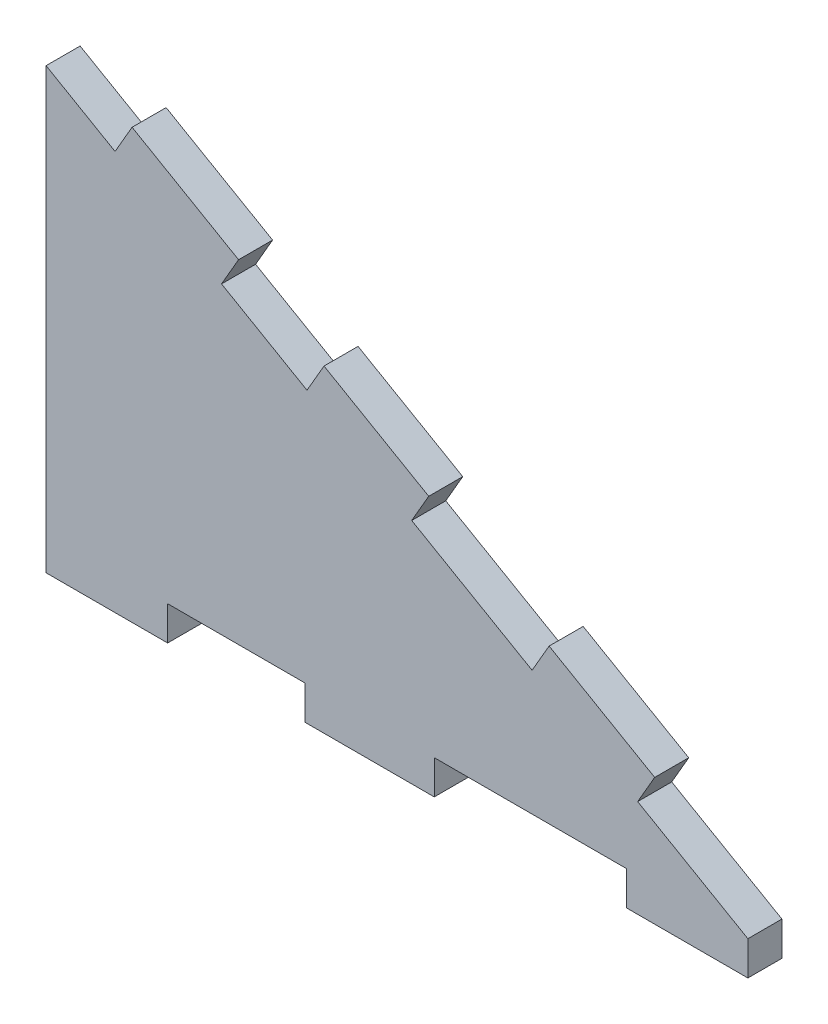
ISO-10303-21;
HEADER;
FILE_DESCRIPTION(('STEP AP214'),'2;1');
FILE_NAME('part.step','',(''),(''),'','','');
FILE_SCHEMA(('AUTOMOTIVE_DESIGN { 1 0 10303 214 1 1 1 1 }'));
ENDSEC;
DATA;
#1=APPLICATION_CONTEXT('core data for automotive mechanical design processes');
#2=APPLICATION_PROTOCOL_DEFINITION('international standard','automotive_design',2000,#1);
#3=PRODUCT_CONTEXT('',#1,'mechanical');
#4=PRODUCT('Part','Part','',(#3));
#5=PRODUCT_RELATED_PRODUCT_CATEGORY('part','',(#4));
#6=PRODUCT_DEFINITION_FORMATION('','',#4);
#7=PRODUCT_DEFINITION_CONTEXT('part definition',#1,'design');
#8=PRODUCT_DEFINITION('design','',#6,#7);
#9=PRODUCT_DEFINITION_SHAPE('','',#8);
#10=(LENGTH_UNIT() NAMED_UNIT(*) SI_UNIT(.MILLI.,.METRE.));
#11=(NAMED_UNIT(*) PLANE_ANGLE_UNIT() SI_UNIT($,.RADIAN.));
#12=(NAMED_UNIT(*) SI_UNIT($,.STERADIAN.) SOLID_ANGLE_UNIT());
#13=UNCERTAINTY_MEASURE_WITH_UNIT(LENGTH_MEASURE(1.E-05),#10,'distance_accuracy_value','');
#14=(GEOMETRIC_REPRESENTATION_CONTEXT(3) GLOBAL_UNCERTAINTY_ASSIGNED_CONTEXT((#13)) GLOBAL_UNIT_ASSIGNED_CONTEXT((#10,
#11,#12)) REPRESENTATION_CONTEXT('',''));
#15=CARTESIAN_POINT('',(0.,0.,0.));
#16=DIRECTION('',(0.,0.,1.));
#17=DIRECTION('',(1.,0.,0.));
#18=AXIS2_PLACEMENT_3D('',#15,#16,#17);
#19=CARTESIAN_POINT('',(0.,63.5,0.));
#20=DIRECTION('',(-0.500011000363013,-0.866019052628739,0.));
#21=DIRECTION('',(0.866019052628739,-0.500011000363013,0.));
#22=AXIS2_PLACEMENT_3D('',#19,#20,#21);
#23=PLANE('',#22);
#24=DIRECTION('',(0.,0.,1.));
#25=VECTOR('',#24,1.);
#26=CARTESIAN_POINT('',(76.1659848752563,19.5242581551638,5.334));
#27=LINE('',#26,#25);
#28=CARTESIAN_POINT('',(76.1659848752563,19.5242581551638,0.));
#29=VERTEX_POINT('',#28);
#30=CARTESIAN_POINT('',(76.1659848752563,19.5242581551638,5.334));
#31=VERTEX_POINT('',#30);
#32=EDGE_CURVE('E223',#29,#31,#27,.T.);
#33=ORIENTED_EDGE('',*,*,#32,.F.);
#34=DIRECTION('',(0.866019052628739,-0.500011000363013,0.));
#35=VECTOR('',#34,1.);
#36=CARTESIAN_POINT('',(0.,63.5,0.));
#37=LINE('',#36,#35);
#38=CARTESIAN_POINT('',(57.297082392142,30.4185436534977,0.));
#39=VERTEX_POINT('',#38);
#40=EDGE_CURVE('E417',#39,#29,#37,.T.);
#41=ORIENTED_EDGE('',*,*,#40,.F.);
#42=DIRECTION('',(0.,0.,-1.));
#43=VECTOR('',#42,1.);
#44=CARTESIAN_POINT('',(57.2970823921421,30.4185436534977,5.334));
#45=LINE('',#44,#43);
#46=CARTESIAN_POINT('',(57.2970823921421,30.4185436534977,5.334));
#47=VERTEX_POINT('',#46);
#48=EDGE_CURVE('E228',#47,#39,#45,.T.);
#49=ORIENTED_EDGE('',*,*,#48,.F.);
#50=DIRECTION('',(0.866019052628739,-0.500011000363013,0.));
#51=VECTOR('',#50,1.);
#52=CARTESIAN_POINT('',(0.,63.5,5.334));
#53=LINE('',#52,#51);
#54=EDGE_CURVE('E396',#47,#31,#53,.T.);
#55=ORIENTED_EDGE('',*,*,#54,.T.);
#56=EDGE_LOOP('',(#33,#41,#49,#55));
#57=FACE_BOUND('',#56,.T.);
#58=ADVANCED_FACE('F37',(#57),#23,.F.);
#59=DIRECTION('',(0.,0.,-1.));
#60=VECTOR('',#59,1.);
#61=CARTESIAN_POINT('',(92.710457342444,9.97202231960511,5.334));
#62=LINE('',#61,#60);
#63=CARTESIAN_POINT('',(92.710457342444,9.97202231960511,5.334));
#64=VERTEX_POINT('',#63);
#65=CARTESIAN_POINT('',(92.710457342444,9.9720223196051,0.));
#66=VERTEX_POINT('',#65);
#67=EDGE_CURVE('E219',#64,#66,#62,.T.);
#68=ORIENTED_EDGE('',*,*,#67,.F.);
#69=CARTESIAN_POINT('',(109.982,0.,5.334));
#70=VERTEX_POINT('',#69);
#71=EDGE_CURVE('E341',#64,#70,#53,.T.);
#72=ORIENTED_EDGE('',*,*,#71,.T.);
#73=DIRECTION('',(0.,0.,-1.));
#74=VECTOR('',#73,1.);
#75=CARTESIAN_POINT('',(109.982,0.,5.334));
#76=LINE('',#75,#74);
#77=CARTESIAN_POINT('',(109.982,0.,0.));
#78=VERTEX_POINT('',#77);
#79=EDGE_CURVE('E41',#70,#78,#76,.T.);
#80=ORIENTED_EDGE('',*,*,#79,.T.);
#81=EDGE_CURVE('E347',#66,#78,#37,.T.);
#82=ORIENTED_EDGE('',*,*,#81,.F.);
#83=EDGE_LOOP('',(#68,#72,#80,#82));
#84=FACE_BOUND('',#83,.T.);
#85=ADVANCED_FACE('F395',(#84),#23,.F.);
#86=DIRECTION('',(0.,0.,1.));
#87=VECTOR('',#86,1.);
#88=CARTESIAN_POINT('',(40.889341102424,39.8918353912102,5.334));
#89=LINE('',#88,#87);
#90=CARTESIAN_POINT('',(40.889341102424,39.8918353912102,0.));
#91=VERTEX_POINT('',#90);
#92=CARTESIAN_POINT('',(40.889341102424,39.8918353912102,5.334));
#93=VERTEX_POINT('',#92);
#94=EDGE_CURVE('E225',#91,#93,#89,.T.);
#95=ORIENTED_EDGE('',*,*,#94,.F.);
#96=CARTESIAN_POINT('',(27.4967098552336,47.6243014692647,0.));
#97=VERTEX_POINT('',#96);
#98=EDGE_CURVE('E346',#97,#91,#37,.T.);
#99=ORIENTED_EDGE('',*,*,#98,.F.);
#100=DIRECTION('',(0.,0.,-1.));
#101=VECTOR('',#100,1.);
#102=CARTESIAN_POINT('',(27.4967098552336,47.6243014692647,5.334));
#103=LINE('',#102,#101);
#104=CARTESIAN_POINT('',(27.4967098552336,47.6243014692647,5.334));
#105=VERTEX_POINT('',#104);
#106=EDGE_CURVE('E255',#105,#97,#103,.T.);
#107=ORIENTED_EDGE('',*,*,#106,.F.);
#108=EDGE_CURVE('E351',#105,#93,#53,.T.);
#109=ORIENTED_EDGE('',*,*,#108,.T.);
#110=EDGE_LOOP('',(#95,#99,#107,#109));
#111=FACE_BOUND('',#110,.T.);
#112=ADVANCED_FACE('F404',(#111),#23,.F.);
#113=DIRECTION('',(0.,0.,1.));
#114=VECTOR('',#113,1.);
#115=CARTESIAN_POINT('',(10.8084820712743,57.2595369103497,5.334));
#116=LINE('',#115,#114);
#117=CARTESIAN_POINT('',(10.8084820712743,57.2595369103497,0.));
#118=VERTEX_POINT('',#117);
#119=CARTESIAN_POINT('',(10.8084820712743,57.2595369103497,5.334));
#120=VERTEX_POINT('',#119);
#121=EDGE_CURVE('E250',#118,#120,#116,.T.);
#122=ORIENTED_EDGE('',*,*,#121,.F.);
#123=CARTESIAN_POINT('',(0.,63.5,0.));
#124=VERTEX_POINT('',#123);
#125=EDGE_CURVE('E342',#124,#118,#37,.T.);
#126=ORIENTED_EDGE('',*,*,#125,.F.);
#127=DIRECTION('',(0.,0.,-1.));
#128=VECTOR('',#127,1.);
#129=CARTESIAN_POINT('',(0.,63.5,5.334));
#130=LINE('',#129,#128);
#131=CARTESIAN_POINT('',(0.,63.5,5.334));
#132=VERTEX_POINT('',#131);
#133=EDGE_CURVE('E11',#132,#124,#130,.T.);
#134=ORIENTED_EDGE('',*,*,#133,.F.);
#135=EDGE_CURVE('E348',#132,#120,#53,.T.);
#136=ORIENTED_EDGE('',*,*,#135,.T.);
#137=EDGE_LOOP('',(#122,#126,#134,#136));
#138=FACE_BOUND('',#137,.T.);
#139=ADVANCED_FACE('F438',(#138),#23,.F.);
#140=CARTESIAN_POINT('',(0.,0.,5.334));
#141=DIRECTION('',(0.,1.,0.));
#142=DIRECTION('',(0.,0.,1.));
#143=AXIS2_PLACEMENT_3D('',#140,#141,#142);
#144=PLANE('',#143);
#145=DIRECTION('',(0.,0.,-1.));
#146=VECTOR('',#145,1.);
#147=CARTESIAN_POINT('',(90.932,0.,5.334));
#148=LINE('',#147,#146);
#149=CARTESIAN_POINT('',(90.932,0.,5.334));
#150=VERTEX_POINT('',#149);
#151=CARTESIAN_POINT('',(90.932,0.,0.));
#152=VERTEX_POINT('',#151);
#153=EDGE_CURVE('E273',#150,#152,#148,.T.);
#154=ORIENTED_EDGE('',*,*,#153,.F.);
#155=DIRECTION('',(1.,0.,0.));
#156=VECTOR('',#155,1.);
#157=CARTESIAN_POINT('',(0.,0.,5.334));
#158=LINE('',#157,#156);
#159=CARTESIAN_POINT('',(60.8337417971664,0.,5.334));
#160=VERTEX_POINT('',#159);
#161=EDGE_CURVE('E356',#160,#150,#158,.T.);
#162=ORIENTED_EDGE('',*,*,#161,.F.);
#163=DIRECTION('',(0.,0.,1.));
#164=VECTOR('',#163,1.);
#165=CARTESIAN_POINT('',(60.8337417971664,0.,5.334));
#166=LINE('',#165,#164);
#167=CARTESIAN_POINT('',(60.8337417971664,0.,0.));
#168=VERTEX_POINT('',#167);
#169=EDGE_CURVE('E300',#168,#160,#166,.T.);
#170=ORIENTED_EDGE('',*,*,#169,.F.);
#171=DIRECTION('',(1.,0.,0.));
#172=VECTOR('',#171,1.);
#173=CARTESIAN_POINT('',(0.,0.,0.));
#174=LINE('',#173,#172);
#175=EDGE_CURVE('E345',#168,#152,#174,.T.);
#176=ORIENTED_EDGE('',*,*,#175,.T.);
#177=EDGE_LOOP('',(#154,#162,#170,#176));
#178=FACE_BOUND('',#177,.T.);
#179=ADVANCED_FACE('F372',(#178),#144,.F.);
#180=DIRECTION('',(0.,0.,-1.));
#181=VECTOR('',#180,1.);
#182=CARTESIAN_POINT('',(40.5379018701674,0.,5.334));
#183=LINE('',#182,#181);
#184=CARTESIAN_POINT('',(40.5379018701674,0.,5.334));
#185=VERTEX_POINT('',#184);
#186=CARTESIAN_POINT('',(40.5379018701674,0.,0.));
#187=VERTEX_POINT('',#186);
#188=EDGE_CURVE('E295',#185,#187,#183,.T.);
#189=ORIENTED_EDGE('',*,*,#188,.F.);
#190=CARTESIAN_POINT('',(19.05,0.,5.334));
#191=VERTEX_POINT('',#190);
#192=EDGE_CURVE('E352',#191,#185,#158,.T.);
#193=ORIENTED_EDGE('',*,*,#192,.F.);
#194=DIRECTION('',(0.,0.,1.));
#195=VECTOR('',#194,1.);
#196=CARTESIAN_POINT('',(19.05,0.,5.334));
#197=LINE('',#196,#195);
#198=CARTESIAN_POINT('',(19.05,0.,0.));
#199=VERTEX_POINT('',#198);
#200=EDGE_CURVE('E322',#199,#191,#197,.T.);
#201=ORIENTED_EDGE('',*,*,#200,.F.);
#202=EDGE_CURVE('E359',#199,#187,#174,.T.);
#203=ORIENTED_EDGE('',*,*,#202,.T.);
#204=EDGE_LOOP('',(#189,#193,#201,#203));
#205=FACE_BOUND('',#204,.T.);
#206=ADVANCED_FACE('F39',(#205),#144,.F.);
#207=CARTESIAN_POINT('',(0.,0.,5.334));
#208=DIRECTION('',(-1.,0.,0.));
#209=DIRECTION('',(0.,0.,1.));
#210=AXIS2_PLACEMENT_3D('',#207,#208,#209);
#211=PLANE('',#210);
#212=DIRECTION('',(0.,1.,0.));
#213=VECTOR('',#212,1.);
#214=CARTESIAN_POINT('',(0.,0.,0.));
#215=LINE('',#214,#213);
#216=CARTESIAN_POINT('',(0.,-5.334,0.));
#217=VERTEX_POINT('',#216);
#218=EDGE_CURVE('E361',#217,#124,#215,.T.);
#219=ORIENTED_EDGE('',*,*,#218,.F.);
#220=DIRECTION('',(0.,0.,-1.));
#221=VECTOR('',#220,1.);
#222=CARTESIAN_POINT('',(0.,-5.334,5.334));
#223=LINE('',#222,#221);
#224=CARTESIAN_POINT('',(0.,-5.334,5.334));
#225=VERTEX_POINT('',#224);
#226=EDGE_CURVE('E323',#225,#217,#223,.T.);
#227=ORIENTED_EDGE('',*,*,#226,.F.);
#228=DIRECTION('',(0.,1.,0.));
#229=VECTOR('',#228,1.);
#230=CARTESIAN_POINT('',(0.,0.,5.334));
#231=LINE('',#230,#229);
#232=EDGE_CURVE('E355',#225,#132,#231,.T.);
#233=ORIENTED_EDGE('',*,*,#232,.T.);
#234=ORIENTED_EDGE('',*,*,#133,.T.);
#235=EDGE_LOOP('',(#219,#227,#233,#234));
#236=FACE_BOUND('',#235,.T.);
#237=ADVANCED_FACE('F505',(#236),#211,.T.);
#238=CARTESIAN_POINT('',(0.,0.,5.334));
#239=DIRECTION('',(0.,0.,1.));
#240=DIRECTION('',(1.,0.,0.));
#241=AXIS2_PLACEMENT_3D('',#238,#239,#240);
#242=PLANE('',#241);
#243=ORIENTED_EDGE('',*,*,#135,.F.);
#244=ORIENTED_EDGE('',*,*,#232,.F.);
#245=DIRECTION('',(-1.,0.,0.));
#246=VECTOR('',#245,1.);
#247=CARTESIAN_POINT('',(0.,-5.334,5.334));
#248=LINE('',#247,#246);
#249=CARTESIAN_POINT('',(19.05,-5.334,5.334));
#250=VERTEX_POINT('',#249);
#251=EDGE_CURVE('E330',#250,#225,#248,.T.);
#252=ORIENTED_EDGE('',*,*,#251,.F.);
#253=DIRECTION('',(0.,1.,0.));
#254=VECTOR('',#253,1.);
#255=CARTESIAN_POINT('',(19.05,-5.334,5.334));
#256=LINE('',#255,#254);
#257=EDGE_CURVE('E333',#250,#191,#256,.T.);
#258=ORIENTED_EDGE('',*,*,#257,.T.);
#259=ORIENTED_EDGE('',*,*,#192,.T.);
#260=DIRECTION('',(0.,1.,0.));
#261=VECTOR('',#260,1.);
#262=CARTESIAN_POINT('',(40.5379018701674,-5.334,5.334));
#263=LINE('',#262,#261);
#264=CARTESIAN_POINT('',(40.5379018701674,-5.334,5.334));
#265=VERTEX_POINT('',#264);
#266=EDGE_CURVE('E306',#265,#185,#263,.T.);
#267=ORIENTED_EDGE('',*,*,#266,.F.);
#268=DIRECTION('',(-1.,0.,0.));
#269=VECTOR('',#268,1.);
#270=CARTESIAN_POINT('',(40.5379018701674,-5.334,5.334));
#271=LINE('',#270,#269);
#272=CARTESIAN_POINT('',(60.8337417971664,-5.334,5.334));
#273=VERTEX_POINT('',#272);
#274=EDGE_CURVE('E304',#273,#265,#271,.T.);
#275=ORIENTED_EDGE('',*,*,#274,.F.);
#276=DIRECTION('',(0.,1.,0.));
#277=VECTOR('',#276,1.);
#278=CARTESIAN_POINT('',(60.8337417971664,-5.334,5.334));
#279=LINE('',#278,#277);
#280=EDGE_CURVE('E313',#273,#160,#279,.T.);
#281=ORIENTED_EDGE('',*,*,#280,.T.);
#282=ORIENTED_EDGE('',*,*,#161,.T.);
#283=DIRECTION('',(0.,1.,0.));
#284=VECTOR('',#283,1.);
#285=CARTESIAN_POINT('',(90.932,-5.334,5.334));
#286=LINE('',#285,#284);
#287=CARTESIAN_POINT('',(90.932,-5.334,5.334));
#288=VERTEX_POINT('',#287);
#289=EDGE_CURVE('E290',#288,#150,#286,.T.);
#290=ORIENTED_EDGE('',*,*,#289,.F.);
#291=DIRECTION('',(-1.,0.,0.));
#292=VECTOR('',#291,1.);
#293=CARTESIAN_POINT('',(109.982,-5.334,5.334));
#294=LINE('',#293,#292);
#295=CARTESIAN_POINT('',(109.982,-5.334,5.334));
#296=VERTEX_POINT('',#295);
#297=EDGE_CURVE('E277',#296,#288,#294,.T.);
#298=ORIENTED_EDGE('',*,*,#297,.F.);
#299=DIRECTION('',(0.,1.,0.));
#300=VECTOR('',#299,1.);
#301=CARTESIAN_POINT('',(109.982,-5.334,5.334));
#302=LINE('',#301,#300);
#303=EDGE_CURVE('E292',#296,#70,#302,.T.);
#304=ORIENTED_EDGE('',*,*,#303,.T.);
#305=ORIENTED_EDGE('',*,*,#71,.F.);
#306=DIRECTION('',(-0.500011000363013,-0.866019052628739,0.));
#307=VECTOR('',#306,1.);
#308=CARTESIAN_POINT('',(95.3775160183803,14.5913679463268,5.334));
#309=LINE('',#308,#307);
#310=CARTESIAN_POINT('',(95.3775160183803,14.5913679463268,5.334));
#311=VERTEX_POINT('',#310);
#312=EDGE_CURVE('E208',#311,#64,#309,.T.);
#313=ORIENTED_EDGE('',*,*,#312,.F.);
#314=DIRECTION('',(0.866019052628739,-0.500011000363014,0.));
#315=VECTOR('',#314,1.);
#316=CARTESIAN_POINT('',(78.8330435511926,24.1436037818855,5.334));
#317=LINE('',#316,#315);
#318=CARTESIAN_POINT('',(78.8330435511926,24.1436037818855,5.334));
#319=VERTEX_POINT('',#318);
#320=EDGE_CURVE('E199',#319,#311,#317,.T.);
#321=ORIENTED_EDGE('',*,*,#320,.F.);
#322=DIRECTION('',(-0.500011000363013,-0.866019052628739,0.));
#323=VECTOR('',#322,1.);
#324=CARTESIAN_POINT('',(78.8330435511926,24.1436037818855,5.334));
#325=LINE('',#324,#323);
#326=EDGE_CURVE('E205',#319,#31,#325,.T.);
#327=ORIENTED_EDGE('',*,*,#326,.T.);
#328=ORIENTED_EDGE('',*,*,#54,.F.);
#329=DIRECTION('',(-0.500011000363013,-0.866019052628739,0.));
#330=VECTOR('',#329,1.);
#331=CARTESIAN_POINT('',(59.9641410680784,35.0378892802194,5.334));
#332=LINE('',#331,#330);
#333=CARTESIAN_POINT('',(59.9641410680784,35.0378892802194,5.334));
#334=VERTEX_POINT('',#333);
#335=EDGE_CURVE('E246',#334,#47,#332,.T.);
#336=ORIENTED_EDGE('',*,*,#335,.F.);
#337=DIRECTION('',(0.866019052628739,-0.500011000363013,0.));
#338=VECTOR('',#337,1.);
#339=CARTESIAN_POINT('',(43.5563997783603,44.5111810179319,5.334));
#340=LINE('',#339,#338);
#341=CARTESIAN_POINT('',(43.5563997783603,44.5111810179319,5.334));
#342=VERTEX_POINT('',#341);
#343=EDGE_CURVE('E236',#342,#334,#340,.T.);
#344=ORIENTED_EDGE('',*,*,#343,.F.);
#345=DIRECTION('',(-0.500011000363013,-0.866019052628739,0.));
#346=VECTOR('',#345,1.);
#347=CARTESIAN_POINT('',(43.5563997783603,44.5111810179319,5.334));
#348=LINE('',#347,#346);
#349=EDGE_CURVE('E248',#342,#93,#348,.T.);
#350=ORIENTED_EDGE('',*,*,#349,.T.);
#351=ORIENTED_EDGE('',*,*,#108,.F.);
#352=DIRECTION('',(-0.500011000363013,-0.866019052628739,0.));
#353=VECTOR('',#352,1.);
#354=CARTESIAN_POINT('',(30.16376853117,52.2436470959864,5.334));
#355=LINE('',#354,#353);
#356=CARTESIAN_POINT('',(30.16376853117,52.2436470959864,5.334));
#357=VERTEX_POINT('',#356);
#358=EDGE_CURVE('E269',#357,#105,#355,.T.);
#359=ORIENTED_EDGE('',*,*,#358,.F.);
#360=DIRECTION('',(0.866019052628739,-0.500011000363013,0.));
#361=VECTOR('',#360,1.);
#362=CARTESIAN_POINT('',(13.4755407472106,61.8788825370714,5.334));
#363=LINE('',#362,#361);
#364=CARTESIAN_POINT('',(13.4755407472106,61.8788825370714,5.334));
#365=VERTEX_POINT('',#364);
#366=EDGE_CURVE('E254',#365,#357,#363,.T.);
#367=ORIENTED_EDGE('',*,*,#366,.F.);
#368=DIRECTION('',(-0.500011000363013,-0.866019052628739,0.));
#369=VECTOR('',#368,1.);
#370=CARTESIAN_POINT('',(13.4755407472106,61.8788825370714,5.334));
#371=LINE('',#370,#369);
#372=EDGE_CURVE('E271',#365,#120,#371,.T.);
#373=ORIENTED_EDGE('',*,*,#372,.T.);
#374=EDGE_LOOP('',(#243,#244,#252,#258,#259,#267,#275,#281,#282,#290,#298,#304,#305,#313,#321,
#327,#328,#336,#344,#350,#351,#359,#367,#373));
#375=FACE_BOUND('',#374,.T.);
#376=ADVANCED_FACE('F202',(#375),#242,.T.);
#377=CARTESIAN_POINT('',(0.,0.,0.));
#378=DIRECTION('',(0.,0.,1.));
#379=DIRECTION('',(1.,0.,0.));
#380=AXIS2_PLACEMENT_3D('',#377,#378,#379);
#381=PLANE('',#380);
#382=ORIENTED_EDGE('',*,*,#218,.T.);
#383=ORIENTED_EDGE('',*,*,#125,.T.);
#384=DIRECTION('',(-0.500011000363013,-0.866019052628739,0.));
#385=VECTOR('',#384,1.);
#386=CARTESIAN_POINT('',(13.4755407472106,61.8788825370714,0.));
#387=LINE('',#386,#385);
#388=CARTESIAN_POINT('',(13.4755407472106,61.8788825370714,0.));
#389=VERTEX_POINT('',#388);
#390=EDGE_CURVE('E261',#389,#118,#387,.T.);
#391=ORIENTED_EDGE('',*,*,#390,.F.);
#392=DIRECTION('',(-0.866019052628739,0.500011000363013,0.));
#393=VECTOR('',#392,1.);
#394=CARTESIAN_POINT('',(13.4755407472106,61.8788825370714,0.));
#395=LINE('',#394,#393);
#396=CARTESIAN_POINT('',(30.16376853117,52.2436470959864,0.));
#397=VERTEX_POINT('',#396);
#398=EDGE_CURVE('E259',#397,#389,#395,.T.);
#399=ORIENTED_EDGE('',*,*,#398,.F.);
#400=DIRECTION('',(-0.500011000363013,-0.866019052628739,0.));
#401=VECTOR('',#400,1.);
#402=CARTESIAN_POINT('',(30.16376853117,52.2436470959864,0.));
#403=LINE('',#402,#401);
#404=EDGE_CURVE('E267',#397,#97,#403,.T.);
#405=ORIENTED_EDGE('',*,*,#404,.T.);
#406=ORIENTED_EDGE('',*,*,#98,.T.);
#407=DIRECTION('',(-0.500011000363013,-0.866019052628739,0.));
#408=VECTOR('',#407,1.);
#409=CARTESIAN_POINT('',(43.5563997783603,44.5111810179319,0.));
#410=LINE('',#409,#408);
#411=CARTESIAN_POINT('',(43.5563997783603,44.5111810179319,0.));
#412=VERTEX_POINT('',#411);
#413=EDGE_CURVE('E241',#412,#91,#410,.T.);
#414=ORIENTED_EDGE('',*,*,#413,.F.);
#415=DIRECTION('',(-0.866019052628739,0.500011000363013,0.));
#416=VECTOR('',#415,1.);
#417=CARTESIAN_POINT('',(43.5563997783603,44.5111810179319,0.));
#418=LINE('',#417,#416);
#419=CARTESIAN_POINT('',(59.9641410680784,35.0378892802194,0.));
#420=VERTEX_POINT('',#419);
#421=EDGE_CURVE('E240',#420,#412,#418,.T.);
#422=ORIENTED_EDGE('',*,*,#421,.F.);
#423=DIRECTION('',(-0.500011000363013,-0.866019052628739,0.));
#424=VECTOR('',#423,1.);
#425=CARTESIAN_POINT('',(59.9641410680784,35.0378892802194,0.));
#426=LINE('',#425,#424);
#427=EDGE_CURVE('E59',#420,#39,#426,.T.);
#428=ORIENTED_EDGE('',*,*,#427,.T.);
#429=ORIENTED_EDGE('',*,*,#40,.T.);
#430=DIRECTION('',(-0.500011000363013,-0.866019052628739,0.));
#431=VECTOR('',#430,1.);
#432=CARTESIAN_POINT('',(78.8330435511926,24.1436037818855,0.));
#433=LINE('',#432,#431);
#434=CARTESIAN_POINT('',(78.8330435511926,24.1436037818855,0.));
#435=VERTEX_POINT('',#434);
#436=EDGE_CURVE('E419',#435,#29,#433,.T.);
#437=ORIENTED_EDGE('',*,*,#436,.F.);
#438=DIRECTION('',(-0.866019052628739,0.500011000363014,0.));
#439=VECTOR('',#438,1.);
#440=CARTESIAN_POINT('',(78.8330435511926,24.1436037818855,0.));
#441=LINE('',#440,#439);
#442=CARTESIAN_POINT('',(95.3775160183803,14.5913679463268,0.));
#443=VERTEX_POINT('',#442);
#444=EDGE_CURVE('E216',#443,#435,#441,.T.);
#445=ORIENTED_EDGE('',*,*,#444,.F.);
#446=DIRECTION('',(-0.500011000363013,-0.866019052628739,0.));
#447=VECTOR('',#446,1.);
#448=CARTESIAN_POINT('',(95.3775160183803,14.5913679463268,0.));
#449=LINE('',#448,#447);
#450=EDGE_CURVE('E52',#443,#66,#449,.T.);
#451=ORIENTED_EDGE('',*,*,#450,.T.);
#452=ORIENTED_EDGE('',*,*,#81,.T.);
#453=DIRECTION('',(0.,1.,0.));
#454=VECTOR('',#453,1.);
#455=CARTESIAN_POINT('',(109.982,-5.334,0.));
#456=LINE('',#455,#454);
#457=CARTESIAN_POINT('',(109.982,-5.334,0.));
#458=VERTEX_POINT('',#457);
#459=EDGE_CURVE('E283',#458,#78,#456,.T.);
#460=ORIENTED_EDGE('',*,*,#459,.F.);
#461=DIRECTION('',(1.,0.,0.));
#462=VECTOR('',#461,1.);
#463=CARTESIAN_POINT('',(109.982,-5.334,0.));
#464=LINE('',#463,#462);
#465=CARTESIAN_POINT('',(90.932,-5.334,0.));
#466=VERTEX_POINT('',#465);
#467=EDGE_CURVE('E281',#466,#458,#464,.T.);
#468=ORIENTED_EDGE('',*,*,#467,.F.);
#469=DIRECTION('',(0.,1.,0.));
#470=VECTOR('',#469,1.);
#471=CARTESIAN_POINT('',(90.932,-5.334,0.));
#472=LINE('',#471,#470);
#473=EDGE_CURVE('E287',#466,#152,#472,.T.);
#474=ORIENTED_EDGE('',*,*,#473,.T.);
#475=ORIENTED_EDGE('',*,*,#175,.F.);
#476=DIRECTION('',(0.,1.,0.));
#477=VECTOR('',#476,1.);
#478=CARTESIAN_POINT('',(60.8337417971664,-5.334,0.));
#479=LINE('',#478,#477);
#480=CARTESIAN_POINT('',(60.8337417971664,-5.334,0.));
#481=VERTEX_POINT('',#480);
#482=EDGE_CURVE('E316',#481,#168,#479,.T.);
#483=ORIENTED_EDGE('',*,*,#482,.F.);
#484=DIRECTION('',(1.,0.,0.));
#485=VECTOR('',#484,1.);
#486=CARTESIAN_POINT('',(40.5379018701674,-5.334,0.));
#487=LINE('',#486,#485);
#488=CARTESIAN_POINT('',(40.5379018701674,-5.334,0.));
#489=VERTEX_POINT('',#488);
#490=EDGE_CURVE('E299',#489,#481,#487,.T.);
#491=ORIENTED_EDGE('',*,*,#490,.F.);
#492=DIRECTION('',(0.,1.,0.));
#493=VECTOR('',#492,1.);
#494=CARTESIAN_POINT('',(40.5379018701674,-5.334,0.));
#495=LINE('',#494,#493);
#496=EDGE_CURVE('E319',#489,#187,#495,.T.);
#497=ORIENTED_EDGE('',*,*,#496,.T.);
#498=ORIENTED_EDGE('',*,*,#202,.F.);
#499=DIRECTION('',(0.,1.,0.));
#500=VECTOR('',#499,1.);
#501=CARTESIAN_POINT('',(19.05,-5.334,0.));
#502=LINE('',#501,#500);
#503=CARTESIAN_POINT('',(19.05,-5.334,0.));
#504=VERTEX_POINT('',#503);
#505=EDGE_CURVE('E338',#504,#199,#502,.T.);
#506=ORIENTED_EDGE('',*,*,#505,.F.);
#507=DIRECTION('',(1.,0.,0.));
#508=VECTOR('',#507,1.);
#509=CARTESIAN_POINT('',(0.,-5.334,0.));
#510=LINE('',#509,#508);
#511=EDGE_CURVE('E326',#217,#504,#510,.T.);
#512=ORIENTED_EDGE('',*,*,#511,.F.);
#513=EDGE_LOOP('',(#382,#383,#391,#399,#405,#406,#414,#422,#428,#429,#437,#445,#451,#452,#460,
#468,#474,#475,#483,#491,#497,#498,#506,#512));
#514=FACE_BOUND('',#513,.T.);
#515=ADVANCED_FACE('F378',(#514),#381,.F.);
#516=CARTESIAN_POINT('',(19.05,-5.334,5.334));
#517=DIRECTION('',(-1.,0.,0.));
#518=DIRECTION('',(0.,0.,1.));
#519=AXIS2_PLACEMENT_3D('',#516,#517,#518);
#520=PLANE('',#519);
#521=ORIENTED_EDGE('',*,*,#200,.T.);
#522=ORIENTED_EDGE('',*,*,#257,.F.);
#523=DIRECTION('',(0.,0.,1.));
#524=VECTOR('',#523,1.);
#525=CARTESIAN_POINT('',(19.05,-5.334,5.334));
#526=LINE('',#525,#524);
#527=EDGE_CURVE('E328',#504,#250,#526,.T.);
#528=ORIENTED_EDGE('',*,*,#527,.F.);
#529=ORIENTED_EDGE('',*,*,#505,.T.);
#530=EDGE_LOOP('',(#521,#522,#528,#529));
#531=FACE_BOUND('',#530,.T.);
#532=ADVANCED_FACE('F488',(#531),#520,.F.);
#533=CARTESIAN_POINT('',(0.,-5.334,0.));
#534=DIRECTION('',(0.,-1.,0.));
#535=DIRECTION('',(0.,0.,-1.));
#536=AXIS2_PLACEMENT_3D('',#533,#534,#535);
#537=PLANE('',#536);
#538=ORIENTED_EDGE('',*,*,#226,.T.);
#539=ORIENTED_EDGE('',*,*,#511,.T.);
#540=ORIENTED_EDGE('',*,*,#527,.T.);
#541=ORIENTED_EDGE('',*,*,#251,.T.);
#542=EDGE_LOOP('',(#538,#539,#540,#541));
#543=FACE_BOUND('',#542,.T.);
#544=ADVANCED_FACE('F485',(#543),#537,.T.);
#545=CARTESIAN_POINT('',(40.5379018701674,-5.334,5.334));
#546=DIRECTION('',(1.,0.,0.));
#547=DIRECTION('',(0.,0.,-1.));
#548=AXIS2_PLACEMENT_3D('',#545,#546,#547);
#549=PLANE('',#548);
#550=ORIENTED_EDGE('',*,*,#188,.T.);
#551=ORIENTED_EDGE('',*,*,#496,.F.);
#552=DIRECTION('',(0.,0.,-1.));
#553=VECTOR('',#552,1.);
#554=CARTESIAN_POINT('',(40.5379018701674,-5.334,5.334));
#555=LINE('',#554,#553);
#556=EDGE_CURVE('E296',#265,#489,#555,.T.);
#557=ORIENTED_EDGE('',*,*,#556,.F.);
#558=ORIENTED_EDGE('',*,*,#266,.T.);
#559=EDGE_LOOP('',(#550,#551,#557,#558));
#560=FACE_BOUND('',#559,.T.);
#561=ADVANCED_FACE('F482',(#560),#549,.F.);
#562=CARTESIAN_POINT('',(60.8337417971664,-5.334,5.334));
#563=DIRECTION('',(-1.,0.,0.));
#564=DIRECTION('',(0.,0.,1.));
#565=AXIS2_PLACEMENT_3D('',#562,#563,#564);
#566=PLANE('',#565);
#567=ORIENTED_EDGE('',*,*,#169,.T.);
#568=ORIENTED_EDGE('',*,*,#280,.F.);
#569=DIRECTION('',(0.,0.,1.));
#570=VECTOR('',#569,1.);
#571=CARTESIAN_POINT('',(60.8337417971664,-5.334,5.334));
#572=LINE('',#571,#570);
#573=EDGE_CURVE('E302',#481,#273,#572,.T.);
#574=ORIENTED_EDGE('',*,*,#573,.F.);
#575=ORIENTED_EDGE('',*,*,#482,.T.);
#576=EDGE_LOOP('',(#567,#568,#574,#575));
#577=FACE_BOUND('',#576,.T.);
#578=ADVANCED_FACE('F375',(#577),#566,.F.);
#579=CARTESIAN_POINT('',(0.,-5.334,0.));
#580=DIRECTION('',(0.,-1.,0.));
#581=DIRECTION('',(0.,0.,-1.));
#582=AXIS2_PLACEMENT_3D('',#579,#580,#581);
#583=PLANE('',#582);
#584=ORIENTED_EDGE('',*,*,#556,.T.);
#585=ORIENTED_EDGE('',*,*,#490,.T.);
#586=ORIENTED_EDGE('',*,*,#573,.T.);
#587=ORIENTED_EDGE('',*,*,#274,.T.);
#588=EDGE_LOOP('',(#584,#585,#586,#587));
#589=FACE_BOUND('',#588,.T.);
#590=ADVANCED_FACE('F476',(#589),#583,.T.);
#591=CARTESIAN_POINT('',(109.982,-5.334,5.334));
#592=DIRECTION('',(-1.,0.,0.));
#593=DIRECTION('',(0.,0.,1.));
#594=AXIS2_PLACEMENT_3D('',#591,#592,#593);
#595=PLANE('',#594);
#596=ORIENTED_EDGE('',*,*,#79,.F.);
#597=ORIENTED_EDGE('',*,*,#303,.F.);
#598=DIRECTION('',(0.,0.,1.));
#599=VECTOR('',#598,1.);
#600=CARTESIAN_POINT('',(109.982,-5.334,5.334));
#601=LINE('',#600,#599);
#602=EDGE_CURVE('E274',#458,#296,#601,.T.);
#603=ORIENTED_EDGE('',*,*,#602,.F.);
#604=ORIENTED_EDGE('',*,*,#459,.T.);
#605=EDGE_LOOP('',(#596,#597,#603,#604));
#606=FACE_BOUND('',#605,.T.);
#607=ADVANCED_FACE('F391',(#606),#595,.F.);
#608=CARTESIAN_POINT('',(90.932,-5.334,5.334));
#609=DIRECTION('',(1.,0.,0.));
#610=DIRECTION('',(0.,0.,-1.));
#611=AXIS2_PLACEMENT_3D('',#608,#609,#610);
#612=PLANE('',#611);
#613=ORIENTED_EDGE('',*,*,#153,.T.);
#614=ORIENTED_EDGE('',*,*,#473,.F.);
#615=DIRECTION('',(0.,0.,-1.));
#616=VECTOR('',#615,1.);
#617=CARTESIAN_POINT('',(90.932,-5.334,5.334));
#618=LINE('',#617,#616);
#619=EDGE_CURVE('E279',#288,#466,#618,.T.);
#620=ORIENTED_EDGE('',*,*,#619,.F.);
#621=ORIENTED_EDGE('',*,*,#289,.T.);
#622=EDGE_LOOP('',(#613,#614,#620,#621));
#623=FACE_BOUND('',#622,.T.);
#624=ADVANCED_FACE('F383',(#623),#612,.F.);
#625=CARTESIAN_POINT('',(0.,-5.334,0.));
#626=DIRECTION('',(0.,1.,0.));
#627=DIRECTION('',(0.,0.,1.));
#628=AXIS2_PLACEMENT_3D('',#625,#626,#627);
#629=PLANE('',#628);
#630=ORIENTED_EDGE('',*,*,#602,.T.);
#631=ORIENTED_EDGE('',*,*,#297,.T.);
#632=ORIENTED_EDGE('',*,*,#619,.T.);
#633=ORIENTED_EDGE('',*,*,#467,.T.);
#634=EDGE_LOOP('',(#630,#631,#632,#633));
#635=FACE_BOUND('',#634,.T.);
#636=ADVANCED_FACE('F385',(#635),#629,.F.);
#637=CARTESIAN_POINT('',(13.4755407472106,61.8788825370714,5.334));
#638=DIRECTION('',(0.866019052628739,-0.500011000363013,0.));
#639=DIRECTION('',(0.500011000363013,0.866019052628739,0.));
#640=AXIS2_PLACEMENT_3D('',#637,#638,#639);
#641=PLANE('',#640);
#642=ORIENTED_EDGE('',*,*,#121,.T.);
#643=ORIENTED_EDGE('',*,*,#372,.F.);
#644=DIRECTION('',(0.,0.,1.));
#645=VECTOR('',#644,1.);
#646=CARTESIAN_POINT('',(13.4755407472106,61.8788825370714,5.334));
#647=LINE('',#646,#645);
#648=EDGE_CURVE('E251',#389,#365,#647,.T.);
#649=ORIENTED_EDGE('',*,*,#648,.F.);
#650=ORIENTED_EDGE('',*,*,#390,.T.);
#651=EDGE_LOOP('',(#642,#643,#649,#650));
#652=FACE_BOUND('',#651,.T.);
#653=ADVANCED_FACE('F455',(#652),#641,.F.);
#654=CARTESIAN_POINT('',(30.16376853117,52.2436470959864,5.334));
#655=DIRECTION('',(-0.866019052628739,0.500011000363013,0.));
#656=DIRECTION('',(-0.500011000363013,-0.866019052628739,0.));
#657=AXIS2_PLACEMENT_3D('',#654,#655,#656);
#658=PLANE('',#657);
#659=ORIENTED_EDGE('',*,*,#106,.T.);
#660=ORIENTED_EDGE('',*,*,#404,.F.);
#661=DIRECTION('',(0.,0.,-1.));
#662=VECTOR('',#661,1.);
#663=CARTESIAN_POINT('',(30.16376853117,52.2436470959864,5.334));
#664=LINE('',#663,#662);
#665=EDGE_CURVE('E257',#357,#397,#664,.T.);
#666=ORIENTED_EDGE('',*,*,#665,.F.);
#667=ORIENTED_EDGE('',*,*,#358,.T.);
#668=EDGE_LOOP('',(#659,#660,#666,#667));
#669=FACE_BOUND('',#668,.T.);
#670=ADVANCED_FACE('F459',(#669),#658,.F.);
#671=CARTESIAN_POINT('',(30.16376853117,52.2436470959864,0.));
#672=DIRECTION('',(-0.500011000363014,-0.866019052628739,0.));
#673=DIRECTION('',(0.866019052628739,-0.500011000363013,0.));
#674=AXIS2_PLACEMENT_3D('',#671,#672,#673);
#675=PLANE('',#674);
#676=ORIENTED_EDGE('',*,*,#648,.T.);
#677=ORIENTED_EDGE('',*,*,#366,.T.);
#678=ORIENTED_EDGE('',*,*,#665,.T.);
#679=ORIENTED_EDGE('',*,*,#398,.T.);
#680=EDGE_LOOP('',(#676,#677,#678,#679));
#681=FACE_BOUND('',#680,.T.);
#682=ADVANCED_FACE('F457',(#681),#675,.F.);
#683=CARTESIAN_POINT('',(43.5563997783603,44.5111810179319,5.334));
#684=DIRECTION('',(0.866019052628739,-0.500011000363013,0.));
#685=DIRECTION('',(0.500011000363013,0.866019052628739,0.));
#686=AXIS2_PLACEMENT_3D('',#683,#684,#685);
#687=PLANE('',#686);
#688=ORIENTED_EDGE('',*,*,#94,.T.);
#689=ORIENTED_EDGE('',*,*,#349,.F.);
#690=DIRECTION('',(0.,0.,1.));
#691=VECTOR('',#690,1.);
#692=CARTESIAN_POINT('',(43.5563997783603,44.5111810179319,5.334));
#693=LINE('',#692,#691);
#694=EDGE_CURVE('E233',#412,#342,#693,.T.);
#695=ORIENTED_EDGE('',*,*,#694,.F.);
#696=ORIENTED_EDGE('',*,*,#413,.T.);
#697=EDGE_LOOP('',(#688,#689,#695,#696));
#698=FACE_BOUND('',#697,.T.);
#699=ADVANCED_FACE('F413',(#698),#687,.F.);
#700=CARTESIAN_POINT('',(59.9641410680784,35.0378892802194,5.334));
#701=DIRECTION('',(-0.866019052628739,0.500011000363013,0.));
#702=DIRECTION('',(-0.500011000363013,-0.866019052628739,0.));
#703=AXIS2_PLACEMENT_3D('',#700,#701,#702);
#704=PLANE('',#703);
#705=ORIENTED_EDGE('',*,*,#48,.T.);
#706=ORIENTED_EDGE('',*,*,#427,.F.);
#707=DIRECTION('',(0.,0.,-1.));
#708=VECTOR('',#707,1.);
#709=CARTESIAN_POINT('',(59.9641410680784,35.0378892802194,5.334));
#710=LINE('',#709,#708);
#711=EDGE_CURVE('E238',#334,#420,#710,.T.);
#712=ORIENTED_EDGE('',*,*,#711,.F.);
#713=ORIENTED_EDGE('',*,*,#335,.T.);
#714=EDGE_LOOP('',(#705,#706,#712,#713));
#715=FACE_BOUND('',#714,.T.);
#716=ADVANCED_FACE('F547',(#715),#704,.F.);
#717=CARTESIAN_POINT('',(30.16376853117,52.2436470959864,0.));
#718=DIRECTION('',(-0.500011000363013,-0.866019052628739,0.));
#719=DIRECTION('',(0.866019052628739,-0.500011000363013,0.));
#720=AXIS2_PLACEMENT_3D('',#717,#718,#719);
#721=PLANE('',#720);
#722=ORIENTED_EDGE('',*,*,#694,.T.);
#723=ORIENTED_EDGE('',*,*,#343,.T.);
#724=ORIENTED_EDGE('',*,*,#711,.T.);
#725=ORIENTED_EDGE('',*,*,#421,.T.);
#726=EDGE_LOOP('',(#722,#723,#724,#725));
#727=FACE_BOUND('',#726,.T.);
#728=ADVANCED_FACE('F434',(#727),#721,.F.);
#729=CARTESIAN_POINT('',(78.8330435511926,24.1436037818855,5.334));
#730=DIRECTION('',(0.866019052628739,-0.500011000363013,0.));
#731=DIRECTION('',(0.500011000363013,0.866019052628739,0.));
#732=AXIS2_PLACEMENT_3D('',#729,#730,#731);
#733=PLANE('',#732);
#734=ORIENTED_EDGE('',*,*,#32,.T.);
#735=ORIENTED_EDGE('',*,*,#326,.F.);
#736=DIRECTION('',(0.,0.,1.));
#737=VECTOR('',#736,1.);
#738=CARTESIAN_POINT('',(78.8330435511926,24.1436037818855,5.334));
#739=LINE('',#738,#737);
#740=EDGE_CURVE('E212',#435,#319,#739,.T.);
#741=ORIENTED_EDGE('',*,*,#740,.F.);
#742=ORIENTED_EDGE('',*,*,#436,.T.);
#743=EDGE_LOOP('',(#734,#735,#741,#742));
#744=FACE_BOUND('',#743,.T.);
#745=ADVANCED_FACE('F221',(#744),#733,.F.);
#746=CARTESIAN_POINT('',(95.3775160183803,14.5913679463268,5.334));
#747=DIRECTION('',(-0.866019052628739,0.500011000363013,0.));
#748=DIRECTION('',(-0.500011000363013,-0.866019052628739,0.));
#749=AXIS2_PLACEMENT_3D('',#746,#747,#748);
#750=PLANE('',#749);
#751=ORIENTED_EDGE('',*,*,#67,.T.);
#752=ORIENTED_EDGE('',*,*,#450,.F.);
#753=DIRECTION('',(0.,0.,-1.));
#754=VECTOR('',#753,1.);
#755=CARTESIAN_POINT('',(95.3775160183803,14.5913679463268,5.334));
#756=LINE('',#755,#754);
#757=EDGE_CURVE('E211',#311,#443,#756,.T.);
#758=ORIENTED_EDGE('',*,*,#757,.F.);
#759=ORIENTED_EDGE('',*,*,#312,.T.);
#760=EDGE_LOOP('',(#751,#752,#758,#759));
#761=FACE_BOUND('',#760,.T.);
#762=ADVANCED_FACE('F426',(#761),#750,.F.);
#763=CARTESIAN_POINT('',(30.16376853117,52.2436470959864,0.));
#764=DIRECTION('',(-0.500011000363014,-0.866019052628739,0.));
#765=DIRECTION('',(0.866019052628739,-0.500011000363014,0.));
#766=AXIS2_PLACEMENT_3D('',#763,#764,#765);
#767=PLANE('',#766);
#768=ORIENTED_EDGE('',*,*,#740,.T.);
#769=ORIENTED_EDGE('',*,*,#320,.T.);
#770=ORIENTED_EDGE('',*,*,#757,.T.);
#771=ORIENTED_EDGE('',*,*,#444,.T.);
#772=EDGE_LOOP('',(#768,#769,#770,#771));
#773=FACE_BOUND('',#772,.T.);
#774=ADVANCED_FACE('F215',(#773),#767,.F.);
#775=CLOSED_SHELL('',(#58,#85,#112,#139,#179,#206,#237,#376,#515,#532,#544,#561,#578,#590,#607,
#624,#636,#653,#670,#682,#699,#716,#728,#745,#762,#774));
#776=MANIFOLD_SOLID_BREP('B2',#775);
#777=ADVANCED_BREP_SHAPE_REPRESENTATION('',(#18,#776),#14);
#778=SHAPE_DEFINITION_REPRESENTATION(#9,#777);
ENDSEC;
END-ISO-10303-21;
